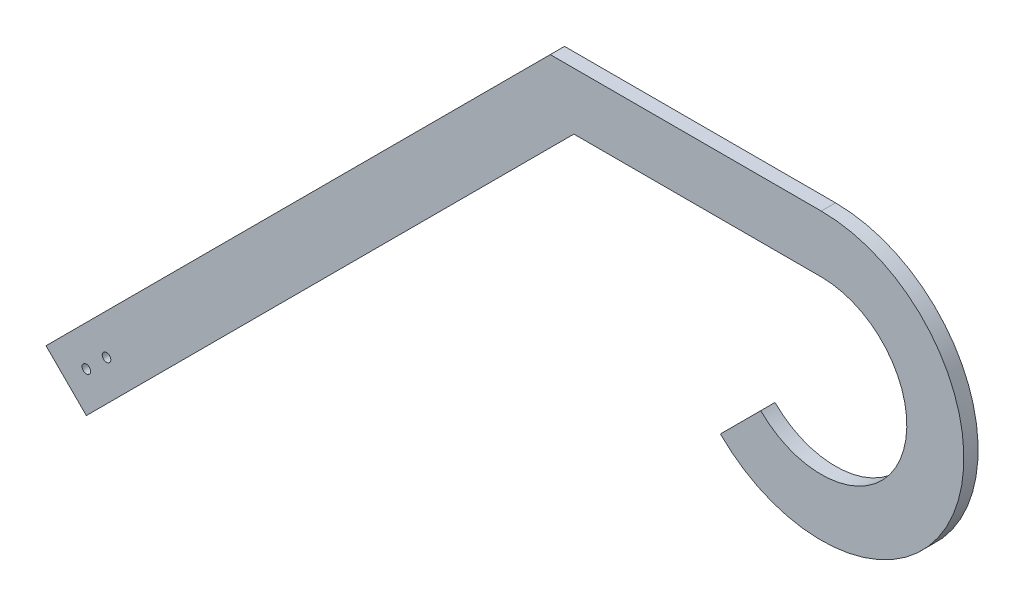
ISO-10303-21;
HEADER;
FILE_DESCRIPTION(('STEP AP214'),'2;1');
FILE_NAME('part.step','',(''),(''),'','','');
FILE_SCHEMA(('AUTOMOTIVE_DESIGN { 1 0 10303 214 1 1 1 1 }'));
ENDSEC;
DATA;
#1=APPLICATION_CONTEXT('core data for automotive mechanical design processes');
#2=APPLICATION_PROTOCOL_DEFINITION('international standard','automotive_design',2000,#1);
#3=PRODUCT_CONTEXT('',#1,'mechanical');
#4=PRODUCT('Part','Part','',(#3));
#5=PRODUCT_RELATED_PRODUCT_CATEGORY('part','',(#4));
#6=PRODUCT_DEFINITION_FORMATION('','',#4);
#7=PRODUCT_DEFINITION_CONTEXT('part definition',#1,'design');
#8=PRODUCT_DEFINITION('design','',#6,#7);
#9=PRODUCT_DEFINITION_SHAPE('','',#8);
#10=(LENGTH_UNIT() NAMED_UNIT(*) SI_UNIT(.MILLI.,.METRE.));
#11=(NAMED_UNIT(*) PLANE_ANGLE_UNIT() SI_UNIT($,.RADIAN.));
#12=(NAMED_UNIT(*) SI_UNIT($,.STERADIAN.) SOLID_ANGLE_UNIT());
#13=UNCERTAINTY_MEASURE_WITH_UNIT(LENGTH_MEASURE(1.E-05),#10,'distance_accuracy_value','');
#14=(GEOMETRIC_REPRESENTATION_CONTEXT(3) GLOBAL_UNCERTAINTY_ASSIGNED_CONTEXT((#13)) GLOBAL_UNIT_ASSIGNED_CONTEXT((#10,
#11,#12)) REPRESENTATION_CONTEXT('',''));
#15=CARTESIAN_POINT('',(0.,0.,0.));
#16=DIRECTION('',(0.,0.,1.));
#17=DIRECTION('',(1.,0.,0.));
#18=AXIS2_PLACEMENT_3D('',#15,#16,#17);
#19=CARTESIAN_POINT('',(0.,0.,5.));
#20=DIRECTION('',(0.,0.,-1.));
#21=DIRECTION('',(-1.,0.,0.));
#22=AXIS2_PLACEMENT_3D('',#19,#20,#21);
#23=CYLINDRICAL_SURFACE('',#22,50.);
#24=CARTESIAN_POINT('',(0.,0.,0.));
#25=DIRECTION('',(0.,0.,1.));
#26=DIRECTION('',(1.,0.,0.));
#27=AXIS2_PLACEMENT_3D('',#24,#25,#26);
#28=CIRCLE('',#27,50.);
#29=CARTESIAN_POINT('',(-35.3553390593273,-35.3553390593275,0.));
#30=VERTEX_POINT('',#29);
#31=CARTESIAN_POINT('',(0.,50.,0.));
#32=VERTEX_POINT('',#31);
#33=EDGE_CURVE('E129',#30,#32,#28,.T.);
#34=ORIENTED_EDGE('',*,*,#33,.T.);
#35=DIRECTION('',(0.,0.,-1.));
#36=VECTOR('',#35,1.);
#37=CARTESIAN_POINT('',(0.,50.,5.));
#38=LINE('',#37,#36);
#39=CARTESIAN_POINT('',(0.,50.,5.));
#40=VERTEX_POINT('',#39);
#41=EDGE_CURVE('E11',#40,#32,#38,.T.);
#42=ORIENTED_EDGE('',*,*,#41,.F.);
#43=CARTESIAN_POINT('',(0.,0.,5.));
#44=DIRECTION('',(0.,0.,1.));
#45=DIRECTION('',(1.,0.,0.));
#46=AXIS2_PLACEMENT_3D('',#43,#44,#45);
#47=CIRCLE('',#46,50.);
#48=CARTESIAN_POINT('',(-35.3553390593273,-35.3553390593275,5.));
#49=VERTEX_POINT('',#48);
#50=EDGE_CURVE('E144',#49,#40,#47,.T.);
#51=ORIENTED_EDGE('',*,*,#50,.F.);
#52=DIRECTION('',(0.,0.,-1.));
#53=VECTOR('',#52,1.);
#54=CARTESIAN_POINT('',(-35.3553390593273,-35.3553390593275,5.));
#55=LINE('',#54,#53);
#56=EDGE_CURVE('E125',#49,#30,#55,.T.);
#57=ORIENTED_EDGE('',*,*,#56,.T.);
#58=EDGE_LOOP('',(#34,#42,#51,#57));
#59=FACE_BOUND('',#58,.T.);
#60=ADVANCED_FACE('F33',(#59),#23,.T.);
#61=CARTESIAN_POINT('',(0.,50.,5.));
#62=DIRECTION('',(0.,-1.,0.));
#63=DIRECTION('',(1.,0.,0.));
#64=AXIS2_PLACEMENT_3D('',#61,#62,#63);
#65=PLANE('',#64);
#66=DIRECTION('',(-1.,0.,0.));
#67=VECTOR('',#66,1.);
#68=CARTESIAN_POINT('',(0.,50.,0.));
#69=LINE('',#68,#67);
#70=CARTESIAN_POINT('',(-95.,50.,0.));
#71=VERTEX_POINT('',#70);
#72=EDGE_CURVE('E132',#32,#71,#69,.T.);
#73=ORIENTED_EDGE('',*,*,#72,.T.);
#74=DIRECTION('',(0.,0.,-1.));
#75=VECTOR('',#74,1.);
#76=CARTESIAN_POINT('',(-95.,50.,5.));
#77=LINE('',#76,#75);
#78=CARTESIAN_POINT('',(-95.,50.,5.));
#79=VERTEX_POINT('',#78);
#80=EDGE_CURVE('E41',#79,#71,#77,.T.);
#81=ORIENTED_EDGE('',*,*,#80,.F.);
#82=DIRECTION('',(-1.,0.,0.));
#83=VECTOR('',#82,1.);
#84=CARTESIAN_POINT('',(0.,50.,5.));
#85=LINE('',#84,#83);
#86=EDGE_CURVE('E92',#40,#79,#85,.T.);
#87=ORIENTED_EDGE('',*,*,#86,.F.);
#88=ORIENTED_EDGE('',*,*,#41,.T.);
#89=EDGE_LOOP('',(#73,#81,#87,#88));
#90=FACE_BOUND('',#89,.T.);
#91=ADVANCED_FACE('F214',(#90),#65,.F.);
#92=CARTESIAN_POINT('',(-95.,50.,5.));
#93=DIRECTION('',(0.707106781186549,-0.707106781186546,0.));
#94=DIRECTION('',(0.707106781186546,0.707106781186549,0.));
#95=AXIS2_PLACEMENT_3D('',#92,#93,#94);
#96=PLANE('',#95);
#97=DIRECTION('',(-0.707106781186546,-0.707106781186549,0.));
#98=VECTOR('',#97,1.);
#99=CARTESIAN_POINT('',(-95.,50.,0.));
#100=LINE('',#99,#98);
#101=CARTESIAN_POINT('',(-271.776695296636,-126.776695296637,0.));
#102=VERTEX_POINT('',#101);
#103=EDGE_CURVE('E135',#71,#102,#100,.T.);
#104=ORIENTED_EDGE('',*,*,#103,.T.);
#105=DIRECTION('',(0.,0.,-1.));
#106=VECTOR('',#105,1.);
#107=CARTESIAN_POINT('',(-271.776695296636,-126.776695296637,5.));
#108=LINE('',#107,#106);
#109=CARTESIAN_POINT('',(-271.776695296636,-126.776695296637,5.));
#110=VERTEX_POINT('',#109);
#111=EDGE_CURVE('E151',#110,#102,#108,.T.);
#112=ORIENTED_EDGE('',*,*,#111,.F.);
#113=DIRECTION('',(-0.707106781186546,-0.707106781186549,0.));
#114=VECTOR('',#113,1.);
#115=CARTESIAN_POINT('',(-95.,50.,5.));
#116=LINE('',#115,#114);
#117=EDGE_CURVE('E159',#79,#110,#116,.T.);
#118=ORIENTED_EDGE('',*,*,#117,.F.);
#119=ORIENTED_EDGE('',*,*,#80,.T.);
#120=EDGE_LOOP('',(#104,#112,#118,#119));
#121=FACE_BOUND('',#120,.T.);
#122=ADVANCED_FACE('F157',(#121),#96,.F.);
#123=CARTESIAN_POINT('',(-271.776695296636,-126.776695296637,5.));
#124=DIRECTION('',(0.707106781186548,0.707106781186547,0.));
#125=DIRECTION('',(-0.707106781186547,0.707106781186548,0.));
#126=AXIS2_PLACEMENT_3D('',#123,#124,#125);
#127=PLANE('',#126);
#128=DIRECTION('',(0.707106781186547,-0.707106781186548,0.));
#129=VECTOR('',#128,1.);
#130=CARTESIAN_POINT('',(-271.776695296636,-126.776695296637,0.));
#131=LINE('',#130,#129);
#132=CARTESIAN_POINT('',(-257.634559672906,-140.918830920368,0.));
#133=VERTEX_POINT('',#132);
#134=EDGE_CURVE('E137',#102,#133,#131,.T.);
#135=ORIENTED_EDGE('',*,*,#134,.T.);
#136=DIRECTION('',(0.,0.,-1.));
#137=VECTOR('',#136,1.);
#138=CARTESIAN_POINT('',(-257.634559672906,-140.918830920368,5.));
#139=LINE('',#138,#137);
#140=CARTESIAN_POINT('',(-257.634559672906,-140.918830920368,5.));
#141=VERTEX_POINT('',#140);
#142=EDGE_CURVE('E148',#141,#133,#139,.T.);
#143=ORIENTED_EDGE('',*,*,#142,.F.);
#144=DIRECTION('',(0.707106781186547,-0.707106781186548,0.));
#145=VECTOR('',#144,1.);
#146=CARTESIAN_POINT('',(-271.776695296636,-126.776695296637,5.));
#147=LINE('',#146,#145);
#148=EDGE_CURVE('E171',#110,#141,#147,.T.);
#149=ORIENTED_EDGE('',*,*,#148,.F.);
#150=ORIENTED_EDGE('',*,*,#111,.T.);
#151=EDGE_LOOP('',(#135,#143,#149,#150));
#152=FACE_BOUND('',#151,.T.);
#153=ADVANCED_FACE('F167',(#152),#127,.F.);
#154=CARTESIAN_POINT('',(-86.7157287525381,30.,5.));
#155=DIRECTION('',(-0.707106781186548,0.707106781186548,0.));
#156=DIRECTION('',(-0.707106781186548,-0.707106781186548,0.));
#157=AXIS2_PLACEMENT_3D('',#154,#155,#156);
#158=PLANE('',#157);
#159=DIRECTION('',(0.707106781186547,0.707106781186547,0.));
#160=VECTOR('',#159,1.);
#161=CARTESIAN_POINT('',(-86.7157287525381,30.,0.));
#162=LINE('',#161,#160);
#163=CARTESIAN_POINT('',(-86.7157287525381,30.,0.));
#164=VERTEX_POINT('',#163);
#165=EDGE_CURVE('E139',#133,#164,#162,.T.);
#166=ORIENTED_EDGE('',*,*,#165,.T.);
#167=DIRECTION('',(0.,0.,-1.));
#168=VECTOR('',#167,1.);
#169=CARTESIAN_POINT('',(-86.7157287525381,30.,5.));
#170=LINE('',#169,#168);
#171=CARTESIAN_POINT('',(-86.7157287525381,30.,5.));
#172=VERTEX_POINT('',#171);
#173=EDGE_CURVE('E120',#172,#164,#170,.T.);
#174=ORIENTED_EDGE('',*,*,#173,.F.);
#175=DIRECTION('',(0.707106781186547,0.707106781186547,0.));
#176=VECTOR('',#175,1.);
#177=CARTESIAN_POINT('',(-86.7157287525381,30.,5.));
#178=LINE('',#177,#176);
#179=EDGE_CURVE('E111',#141,#172,#178,.T.);
#180=ORIENTED_EDGE('',*,*,#179,.F.);
#181=ORIENTED_EDGE('',*,*,#142,.T.);
#182=EDGE_LOOP('',(#166,#174,#180,#181));
#183=FACE_BOUND('',#182,.T.);
#184=ADVANCED_FACE('F170',(#183),#158,.F.);
#185=CARTESIAN_POINT('',(0.,30.,5.));
#186=DIRECTION('',(0.,1.,0.));
#187=DIRECTION('',(0.,0.,1.));
#188=AXIS2_PLACEMENT_3D('',#185,#186,#187);
#189=PLANE('',#188);
#190=DIRECTION('',(1.,0.,0.));
#191=VECTOR('',#190,1.);
#192=CARTESIAN_POINT('',(0.,30.,0.));
#193=LINE('',#192,#191);
#194=CARTESIAN_POINT('',(0.,30.,0.));
#195=VERTEX_POINT('',#194);
#196=EDGE_CURVE('E119',#164,#195,#193,.T.);
#197=ORIENTED_EDGE('',*,*,#196,.T.);
#198=DIRECTION('',(0.,0.,-1.));
#199=VECTOR('',#198,1.);
#200=CARTESIAN_POINT('',(0.,30.,5.));
#201=LINE('',#200,#199);
#202=CARTESIAN_POINT('',(0.,30.,5.));
#203=VERTEX_POINT('',#202);
#204=EDGE_CURVE('E116',#203,#195,#201,.T.);
#205=ORIENTED_EDGE('',*,*,#204,.F.);
#206=DIRECTION('',(1.,0.,0.));
#207=VECTOR('',#206,1.);
#208=CARTESIAN_POINT('',(0.,30.,5.));
#209=LINE('',#208,#207);
#210=EDGE_CURVE('E105',#172,#203,#209,.T.);
#211=ORIENTED_EDGE('',*,*,#210,.F.);
#212=ORIENTED_EDGE('',*,*,#173,.T.);
#213=EDGE_LOOP('',(#197,#205,#211,#212));
#214=FACE_BOUND('',#213,.T.);
#215=ADVANCED_FACE('F117',(#214),#189,.F.);
#216=CARTESIAN_POINT('',(0.,0.,5.));
#217=DIRECTION('',(0.,0.,-1.));
#218=DIRECTION('',(-1.,0.,0.));
#219=AXIS2_PLACEMENT_3D('',#216,#217,#218);
#220=CYLINDRICAL_SURFACE('',#219,30.);
#221=CARTESIAN_POINT('',(0.,0.,0.));
#222=DIRECTION('',(0.,0.,-1.));
#223=DIRECTION('',(1.,0.,0.));
#224=AXIS2_PLACEMENT_3D('',#221,#222,#223);
#225=CIRCLE('',#224,30.);
#226=CARTESIAN_POINT('',(-21.2132034355964,-21.2132034355965,0.));
#227=VERTEX_POINT('',#226);
#228=EDGE_CURVE('E78',#195,#227,#225,.T.);
#229=ORIENTED_EDGE('',*,*,#228,.T.);
#230=DIRECTION('',(0.,0.,-1.));
#231=VECTOR('',#230,1.);
#232=CARTESIAN_POINT('',(-21.2132034355964,-21.2132034355965,5.));
#233=LINE('',#232,#231);
#234=CARTESIAN_POINT('',(-21.2132034355964,-21.2132034355965,5.));
#235=VERTEX_POINT('',#234);
#236=EDGE_CURVE('E121',#235,#227,#233,.T.);
#237=ORIENTED_EDGE('',*,*,#236,.F.);
#238=CARTESIAN_POINT('',(0.,0.,5.));
#239=DIRECTION('',(0.,0.,-1.));
#240=DIRECTION('',(1.,0.,0.));
#241=AXIS2_PLACEMENT_3D('',#238,#239,#240);
#242=CIRCLE('',#241,30.);
#243=EDGE_CURVE('E109',#203,#235,#242,.T.);
#244=ORIENTED_EDGE('',*,*,#243,.F.);
#245=ORIENTED_EDGE('',*,*,#204,.T.);
#246=EDGE_LOOP('',(#229,#237,#244,#245));
#247=FACE_BOUND('',#246,.T.);
#248=ADVANCED_FACE('F123',(#247),#220,.F.);
#249=CARTESIAN_POINT('',(-21.2132034355964,-21.2132034355965,5.));
#250=DIRECTION('',(0.707106781186549,-0.707106781186546,0.));
#251=DIRECTION('',(0.707106781186546,0.707106781186549,0.));
#252=AXIS2_PLACEMENT_3D('',#249,#250,#251);
#253=PLANE('',#252);
#254=DIRECTION('',(-0.707106781186546,-0.707106781186549,0.));
#255=VECTOR('',#254,1.);
#256=CARTESIAN_POINT('',(-21.2132034355964,-21.2132034355965,0.));
#257=LINE('',#256,#255);
#258=EDGE_CURVE('E84',#227,#30,#257,.T.);
#259=ORIENTED_EDGE('',*,*,#258,.T.);
#260=ORIENTED_EDGE('',*,*,#56,.F.);
#261=DIRECTION('',(-0.707106781186546,-0.707106781186549,0.));
#262=VECTOR('',#261,1.);
#263=CARTESIAN_POINT('',(-21.2132034355964,-21.2132034355965,5.));
#264=LINE('',#263,#262);
#265=EDGE_CURVE('E49',#235,#49,#264,.T.);
#266=ORIENTED_EDGE('',*,*,#265,.F.);
#267=ORIENTED_EDGE('',*,*,#236,.T.);
#268=EDGE_LOOP('',(#259,#260,#266,#267));
#269=FACE_BOUND('',#268,.T.);
#270=ADVANCED_FACE('F200',(#269),#253,.F.);
#271=CARTESIAN_POINT('',(0.,0.,5.));
#272=DIRECTION('',(0.,0.,1.));
#273=DIRECTION('',(1.,0.,0.));
#274=AXIS2_PLACEMENT_3D('',#271,#272,#273);
#275=PLANE('',#274);
#276=CARTESIAN_POINT('',(-257.634559672906,-126.776695296637,5.));
#277=DIRECTION('',(0.,0.,1.));
#278=DIRECTION('',(1.,0.,0.));
#279=AXIS2_PLACEMENT_3D('',#276,#277,#278);
#280=CIRCLE('',#279,1.50000000000002);
#281=CARTESIAN_POINT('',(-256.134559672906,-126.776695296637,5.));
#282=VERTEX_POINT('',#281);
#283=EDGE_CURVE('E183',#282,#282,#280,.T.);
#284=ORIENTED_EDGE('',*,*,#283,.F.);
#285=EDGE_LOOP('',(#284));
#286=FACE_BOUND('',#285,.T.);
#287=CARTESIAN_POINT('',(-250.56349186104,-119.705627484772,5.));
#288=DIRECTION('',(0.,0.,1.));
#289=DIRECTION('',(1.,0.,0.));
#290=AXIS2_PLACEMENT_3D('',#287,#288,#289);
#291=CIRCLE('',#290,1.5);
#292=CARTESIAN_POINT('',(-249.06349186104,-119.705627484772,5.));
#293=VERTEX_POINT('',#292);
#294=EDGE_CURVE('E177',#293,#293,#291,.T.);
#295=ORIENTED_EDGE('',*,*,#294,.F.);
#296=EDGE_LOOP('',(#295));
#297=FACE_BOUND('',#296,.T.);
#298=ORIENTED_EDGE('',*,*,#50,.T.);
#299=ORIENTED_EDGE('',*,*,#86,.T.);
#300=ORIENTED_EDGE('',*,*,#117,.T.);
#301=ORIENTED_EDGE('',*,*,#148,.T.);
#302=ORIENTED_EDGE('',*,*,#179,.T.);
#303=ORIENTED_EDGE('',*,*,#210,.T.);
#304=ORIENTED_EDGE('',*,*,#243,.T.);
#305=ORIENTED_EDGE('',*,*,#265,.T.);
#306=EDGE_LOOP('',(#298,#299,#300,#301,#302,#303,#304,#305));
#307=FACE_BOUND('',#306,.T.);
#308=ADVANCED_FACE('F107',(#286,#297,#307),#275,.T.);
#309=CARTESIAN_POINT('',(0.,0.,0.));
#310=DIRECTION('',(0.,0.,1.));
#311=DIRECTION('',(1.,0.,0.));
#312=AXIS2_PLACEMENT_3D('',#309,#310,#311);
#313=PLANE('',#312);
#314=CARTESIAN_POINT('',(-257.634559672906,-126.776695296637,0.));
#315=DIRECTION('',(0.,0.,1.));
#316=DIRECTION('',(1.,0.,0.));
#317=AXIS2_PLACEMENT_3D('',#314,#315,#316);
#318=CIRCLE('',#317,1.50000000000002);
#319=CARTESIAN_POINT('',(-256.134559672906,-126.776695296637,0.));
#320=VERTEX_POINT('',#319);
#321=EDGE_CURVE('E133',#320,#320,#318,.T.);
#322=ORIENTED_EDGE('',*,*,#321,.T.);
#323=EDGE_LOOP('',(#322));
#324=FACE_BOUND('',#323,.T.);
#325=CARTESIAN_POINT('',(-250.56349186104,-119.705627484772,0.));
#326=DIRECTION('',(0.,0.,1.));
#327=DIRECTION('',(1.,0.,0.));
#328=AXIS2_PLACEMENT_3D('',#325,#326,#327);
#329=CIRCLE('',#328,1.5);
#330=CARTESIAN_POINT('',(-249.06349186104,-119.705627484772,0.));
#331=VERTEX_POINT('',#330);
#332=EDGE_CURVE('E180',#331,#331,#329,.T.);
#333=ORIENTED_EDGE('',*,*,#332,.T.);
#334=EDGE_LOOP('',(#333));
#335=FACE_BOUND('',#334,.T.);
#336=ORIENTED_EDGE('',*,*,#33,.F.);
#337=ORIENTED_EDGE('',*,*,#258,.F.);
#338=ORIENTED_EDGE('',*,*,#228,.F.);
#339=ORIENTED_EDGE('',*,*,#196,.F.);
#340=ORIENTED_EDGE('',*,*,#165,.F.);
#341=ORIENTED_EDGE('',*,*,#134,.F.);
#342=ORIENTED_EDGE('',*,*,#103,.F.);
#343=ORIENTED_EDGE('',*,*,#72,.F.);
#344=EDGE_LOOP('',(#336,#337,#338,#339,#340,#341,#342,#343));
#345=FACE_BOUND('',#344,.T.);
#346=ADVANCED_FACE('F163',(#324,#335,#345),#313,.F.);
#347=CARTESIAN_POINT('',(-250.56349186104,-119.705627484772,0.));
#348=DIRECTION('',(0.,0.,1.));
#349=DIRECTION('',(1.,0.,0.));
#350=AXIS2_PLACEMENT_3D('',#347,#348,#349);
#351=CYLINDRICAL_SURFACE('',#350,1.5);
#352=ORIENTED_EDGE('',*,*,#332,.F.);
#353=EDGE_LOOP('',(#352));
#354=FACE_BOUND('',#353,.T.);
#355=ORIENTED_EDGE('',*,*,#294,.T.);
#356=EDGE_LOOP('',(#355));
#357=FACE_BOUND('',#356,.T.);
#358=ADVANCED_FACE('F194',(#354,#357),#351,.F.);
#359=CARTESIAN_POINT('',(-257.634559672906,-126.776695296637,0.));
#360=DIRECTION('',(0.,0.,1.));
#361=DIRECTION('',(1.,0.,0.));
#362=AXIS2_PLACEMENT_3D('',#359,#360,#361);
#363=CYLINDRICAL_SURFACE('',#362,1.50000000000002);
#364=ORIENTED_EDGE('',*,*,#321,.F.);
#365=EDGE_LOOP('',(#364));
#366=FACE_BOUND('',#365,.T.);
#367=ORIENTED_EDGE('',*,*,#283,.T.);
#368=EDGE_LOOP('',(#367));
#369=FACE_BOUND('',#368,.T.);
#370=ADVANCED_FACE('F191',(#366,#369),#363,.F.);
#371=CLOSED_SHELL('',(#60,#91,#122,#153,#184,#215,#248,#270,#308,#346,#358,#370));
#372=MANIFOLD_SOLID_BREP('B2',#371);
#373=ADVANCED_BREP_SHAPE_REPRESENTATION('',(#18,#372),#14);
#374=SHAPE_DEFINITION_REPRESENTATION(#9,#373);
ENDSEC;
END-ISO-10303-21;
